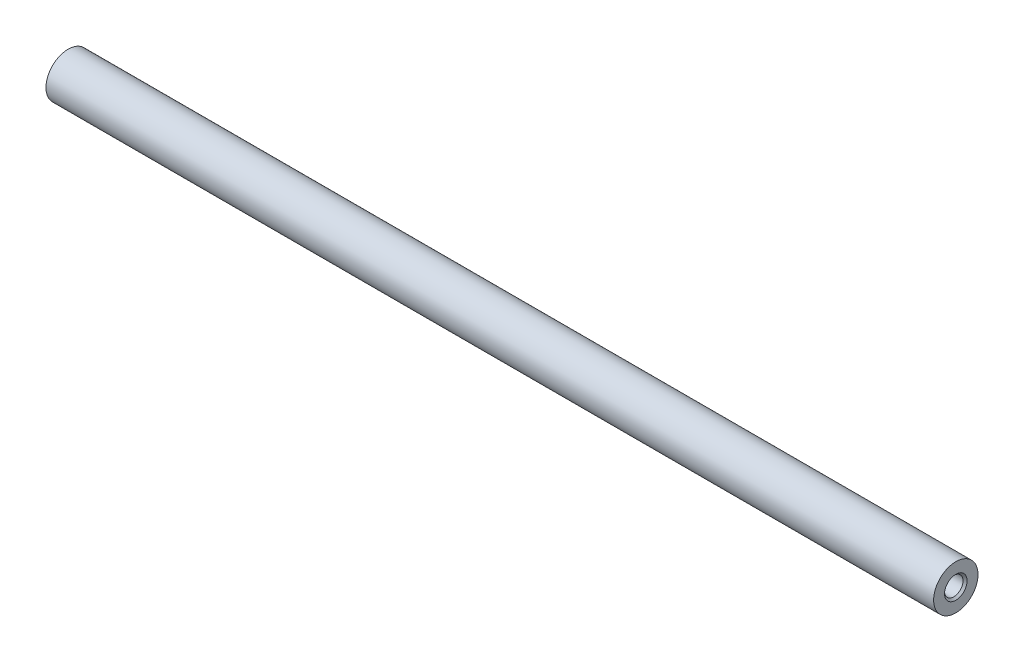
ISO-10303-21;
HEADER;
FILE_DESCRIPTION(('STEP AP214'),'2;1');
FILE_NAME('part.step','',(''),(''),'','','');
FILE_SCHEMA(('AUTOMOTIVE_DESIGN { 1 0 10303 214 1 1 1 1 }'));
ENDSEC;
DATA;
#1=APPLICATION_CONTEXT('core data for automotive mechanical design processes');
#2=APPLICATION_PROTOCOL_DEFINITION('international standard','automotive_design',2000,#1);
#3=PRODUCT_CONTEXT('',#1,'mechanical');
#4=PRODUCT('Part','Part','',(#3));
#5=PRODUCT_RELATED_PRODUCT_CATEGORY('part','',(#4));
#6=PRODUCT_DEFINITION_FORMATION('','',#4);
#7=PRODUCT_DEFINITION_CONTEXT('part definition',#1,'design');
#8=PRODUCT_DEFINITION('design','',#6,#7);
#9=PRODUCT_DEFINITION_SHAPE('','',#8);
#10=(LENGTH_UNIT() NAMED_UNIT(*) SI_UNIT(.MILLI.,.METRE.));
#11=(NAMED_UNIT(*) PLANE_ANGLE_UNIT() SI_UNIT($,.RADIAN.));
#12=(NAMED_UNIT(*) SI_UNIT($,.STERADIAN.) SOLID_ANGLE_UNIT());
#13=UNCERTAINTY_MEASURE_WITH_UNIT(LENGTH_MEASURE(1.E-05),#10,'distance_accuracy_value','');
#14=(GEOMETRIC_REPRESENTATION_CONTEXT(3) GLOBAL_UNCERTAINTY_ASSIGNED_CONTEXT((#13)) GLOBAL_UNIT_ASSIGNED_CONTEXT((#10,
#11,#12)) REPRESENTATION_CONTEXT('',''));
#15=CARTESIAN_POINT('',(0.,0.,0.));
#16=DIRECTION('',(0.,0.,1.));
#17=DIRECTION('',(1.,0.,0.));
#18=AXIS2_PLACEMENT_3D('',#15,#16,#17);
#19=CARTESIAN_POINT('',(120.,0.,0.));
#20=DIRECTION('',(-1.,0.,0.));
#21=DIRECTION('',(0.,0.,1.));
#22=AXIS2_PLACEMENT_3D('',#19,#20,#21);
#23=CYLINDRICAL_SURFACE('',#22,3.);
#24=CARTESIAN_POINT('',(120.,0.,0.));
#25=DIRECTION('',(1.,0.,0.));
#26=DIRECTION('',(0.,0.,-1.));
#27=AXIS2_PLACEMENT_3D('',#24,#25,#26);
#28=CIRCLE('',#27,3.);
#29=CARTESIAN_POINT('',(120.,0.,-3.));
#30=VERTEX_POINT('',#29);
#31=EDGE_CURVE('E10',#30,#30,#28,.T.);
#32=ORIENTED_EDGE('',*,*,#31,.F.);
#33=EDGE_LOOP('',(#32));
#34=FACE_BOUND('',#33,.T.);
#35=CARTESIAN_POINT('',(0.,0.,0.));
#36=DIRECTION('',(1.,0.,0.));
#37=DIRECTION('',(0.,0.,-1.));
#38=AXIS2_PLACEMENT_3D('',#35,#36,#37);
#39=CIRCLE('',#38,3.);
#40=CARTESIAN_POINT('',(0.,0.,-3.));
#41=VERTEX_POINT('',#40);
#42=EDGE_CURVE('E38',#41,#41,#39,.T.);
#43=ORIENTED_EDGE('',*,*,#42,.T.);
#44=EDGE_LOOP('',(#43));
#45=FACE_BOUND('',#44,.T.);
#46=ADVANCED_FACE('F35',(#34,#45),#23,.T.);
#47=CARTESIAN_POINT('',(120.,0.,0.));
#48=DIRECTION('',(1.,0.,0.));
#49=DIRECTION('',(0.,0.,-1.));
#50=AXIS2_PLACEMENT_3D('',#47,#48,#49);
#51=PLANE('',#50);
#52=CARTESIAN_POINT('',(120.,0.,0.));
#53=DIRECTION('',(1.,0.,0.));
#54=DIRECTION('',(0.,0.,-1.));
#55=AXIS2_PLACEMENT_3D('',#52,#53,#54);
#56=CIRCLE('',#55,1.525);
#57=CARTESIAN_POINT('',(120.,0.,-1.525));
#58=VERTEX_POINT('',#57);
#59=EDGE_CURVE('E52',#58,#58,#56,.T.);
#60=ORIENTED_EDGE('',*,*,#59,.F.);
#61=EDGE_LOOP('',(#60));
#62=FACE_BOUND('',#61,.T.);
#63=ORIENTED_EDGE('',*,*,#31,.T.);
#64=EDGE_LOOP('',(#63));
#65=FACE_BOUND('',#64,.T.);
#66=ADVANCED_FACE('F58',(#62,#65),#51,.T.);
#67=CARTESIAN_POINT('',(0.,0.,0.));
#68=DIRECTION('',(1.,0.,0.));
#69=DIRECTION('',(0.,0.,-1.));
#70=AXIS2_PLACEMENT_3D('',#67,#68,#69);
#71=PLANE('',#70);
#72=CARTESIAN_POINT('',(0.,0.,0.));
#73=DIRECTION('',(1.,0.,0.));
#74=DIRECTION('',(0.,0.,-1.));
#75=AXIS2_PLACEMENT_3D('',#72,#73,#74);
#76=CIRCLE('',#75,1.24999999999998);
#77=CARTESIAN_POINT('',(0.,0.,-1.24999999999998));
#78=VERTEX_POINT('',#77);
#79=EDGE_CURVE('E45',#78,#78,#76,.T.);
#80=ORIENTED_EDGE('',*,*,#79,.T.);
#81=EDGE_LOOP('',(#80));
#82=FACE_BOUND('',#81,.T.);
#83=ORIENTED_EDGE('',*,*,#42,.F.);
#84=EDGE_LOOP('',(#83));
#85=FACE_BOUND('',#84,.T.);
#86=ADVANCED_FACE('F60',(#82,#85),#71,.F.);
#87=CARTESIAN_POINT('',(120.,0.,0.));
#88=DIRECTION('',(1.,0.,0.));
#89=DIRECTION('',(0.,0.,-1.));
#90=AXIS2_PLACEMENT_3D('',#87,#88,#89);
#91=CYLINDRICAL_SURFACE('',#90,1.24999999999999);
#92=ORIENTED_EDGE('',*,*,#79,.F.);
#93=EDGE_LOOP('',(#92));
#94=FACE_BOUND('',#93,.T.);
#95=CARTESIAN_POINT('',(119.725,0.,0.));
#96=DIRECTION('',(1.,0.,0.));
#97=DIRECTION('',(0.,0.,-1.));
#98=AXIS2_PLACEMENT_3D('',#95,#96,#97);
#99=CIRCLE('',#98,1.24999999999999);
#100=CARTESIAN_POINT('',(119.725,0.,-1.24999999999999));
#101=VERTEX_POINT('',#100);
#102=EDGE_CURVE('E49',#101,#101,#99,.T.);
#103=ORIENTED_EDGE('',*,*,#102,.T.);
#104=EDGE_LOOP('',(#103));
#105=FACE_BOUND('',#104,.T.);
#106=ADVANCED_FACE('F66',(#94,#105),#91,.F.);
#107=CARTESIAN_POINT('',(120.,0.,0.));
#108=DIRECTION('',(1.,0.,0.));
#109=DIRECTION('',(0.,0.,-1.));
#110=AXIS2_PLACEMENT_3D('',#107,#108,#109);
#111=CONICAL_SURFACE('',#110,1.525,0.785398163397451);
#112=ORIENTED_EDGE('',*,*,#102,.F.);
#113=EDGE_LOOP('',(#112));
#114=FACE_BOUND('',#113,.T.);
#115=ORIENTED_EDGE('',*,*,#59,.T.);
#116=EDGE_LOOP('',(#115));
#117=FACE_BOUND('',#116,.T.);
#118=ADVANCED_FACE('F56',(#114,#117),#111,.F.);
#119=CLOSED_SHELL('',(#46,#66,#86,#106,#118));
#120=MANIFOLD_SOLID_BREP('B2',#119);
#121=ADVANCED_BREP_SHAPE_REPRESENTATION('',(#18,#120),#14);
#122=SHAPE_DEFINITION_REPRESENTATION(#9,#121);
ENDSEC;
END-ISO-10303-21;
